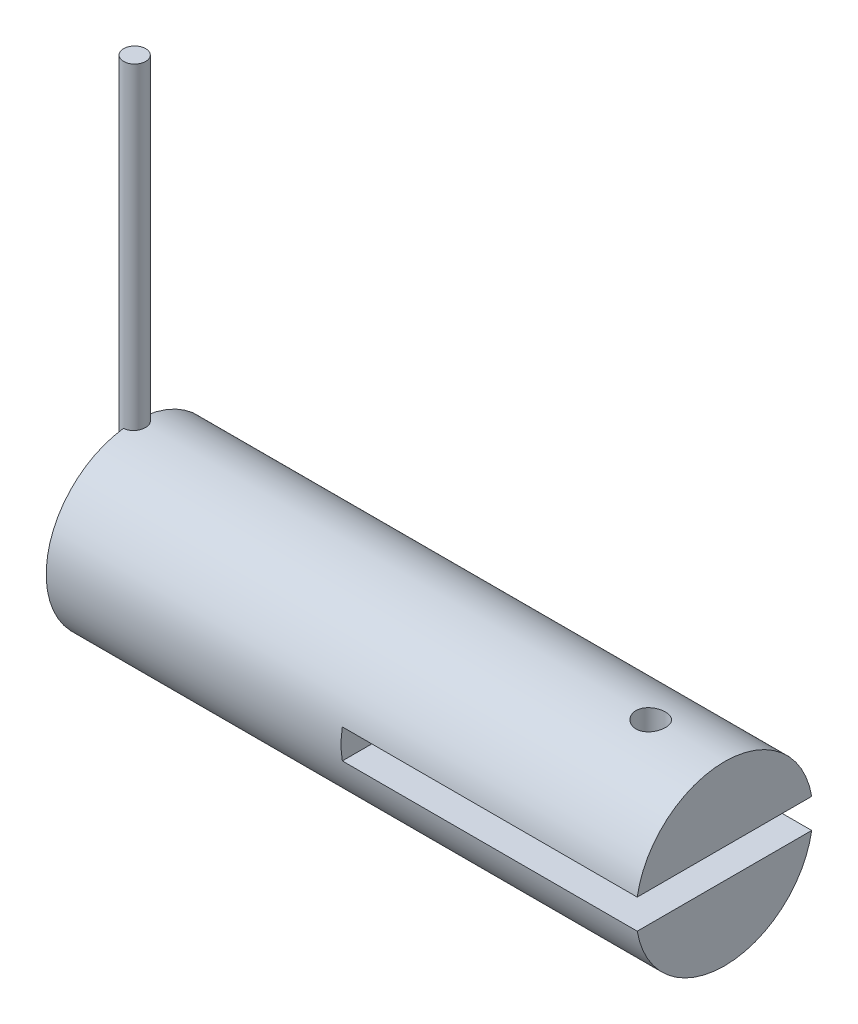
ISO-10303-21;
HEADER;
FILE_DESCRIPTION(('STEP AP214'),'2;1');
FILE_NAME('part.step','',(''),(''),'','','');
FILE_SCHEMA(('AUTOMOTIVE_DESIGN { 1 0 10303 214 1 1 1 1 }'));
ENDSEC;
DATA;
#1=APPLICATION_CONTEXT('core data for automotive mechanical design processes');
#2=APPLICATION_PROTOCOL_DEFINITION('international standard','automotive_design',2000,#1);
#3=PRODUCT_CONTEXT('',#1,'mechanical');
#4=PRODUCT('Part','Part','',(#3));
#5=PRODUCT_RELATED_PRODUCT_CATEGORY('part','',(#4));
#6=PRODUCT_DEFINITION_FORMATION('','',#4);
#7=PRODUCT_DEFINITION_CONTEXT('part definition',#1,'design');
#8=PRODUCT_DEFINITION('design','',#6,#7);
#9=PRODUCT_DEFINITION_SHAPE('','',#8);
#10=(LENGTH_UNIT() NAMED_UNIT(*) SI_UNIT(.MILLI.,.METRE.));
#11=(NAMED_UNIT(*) PLANE_ANGLE_UNIT() SI_UNIT($,.RADIAN.));
#12=(NAMED_UNIT(*) SI_UNIT($,.STERADIAN.) SOLID_ANGLE_UNIT());
#13=UNCERTAINTY_MEASURE_WITH_UNIT(LENGTH_MEASURE(1.E-05),#10,'distance_accuracy_value','');
#14=(GEOMETRIC_REPRESENTATION_CONTEXT(3) GLOBAL_UNCERTAINTY_ASSIGNED_CONTEXT((#13)) GLOBAL_UNIT_ASSIGNED_CONTEXT((#10,
#11,#12)) REPRESENTATION_CONTEXT('',''));
#15=CARTESIAN_POINT('',(0.,0.,0.));
#16=DIRECTION('',(0.,0.,1.));
#17=DIRECTION('',(1.,0.,0.));
#18=AXIS2_PLACEMENT_3D('',#15,#16,#17);
#19=CARTESIAN_POINT('',(80.,0.,0.));
#20=DIRECTION('',(-1.,0.,0.));
#21=DIRECTION('',(0.,0.,1.));
#22=AXIS2_PLACEMENT_3D('',#19,#20,#21);
#23=CYLINDRICAL_SURFACE('',#22,12.);
#24=CARTESIAN_POINT('',(70.,11.8321595661992,-2.));
#25=CARTESIAN_POINT('',(70.1115005985295,11.8321615789328,-1.99999551873586));
#26=CARTESIAN_POINT('',(70.2230620848572,11.8337527390819,-1.99064413522262));
#27=CARTESIAN_POINT('',(70.4430548346105,11.8399396576003,-1.9535019424531));
#28=CARTESIAN_POINT('',(70.5514831150064,11.844538186771,-1.92569412824688));
#29=CARTESIAN_POINT('',(70.7619938266733,11.8562048749385,-1.8525036349364));
#30=CARTESIAN_POINT('',(70.8640814789298,11.8632709694721,-1.80713564394559));
#31=CARTESIAN_POINT('',(71.0591847637742,11.8790741768183,-1.70014919751158));
#32=CARTESIAN_POINT('',(71.1522014156618,11.8878111015538,-1.63853257080107));
#33=CARTESIAN_POINT('',(71.3274502797956,11.906067769247,-1.50015002157324));
#34=CARTESIAN_POINT('',(71.409580105109,11.9155937386236,-1.42325523914587));
#35=CARTESIAN_POINT('',(71.5598346454894,11.9342998453486,-1.25677760375622));
#36=CARTESIAN_POINT('',(71.6279585304923,11.9434799621739,-1.16719399931998));
#37=CARTESIAN_POINT('',(71.7486516537754,11.9605258958617,-0.977218295958691));
#38=CARTESIAN_POINT('',(71.8011256061854,11.9683835394587,-0.87676486516537));
#39=CARTESIAN_POINT('',(71.8884168564244,11.9818298956567,-0.668316497379096));
#40=CARTESIAN_POINT('',(71.9232353023079,11.9874187557813,-0.560322051262553));
#41=CARTESIAN_POINT('',(71.9739140279871,11.9956538777952,-0.340914981075398));
#42=CARTESIAN_POINT('',(71.9899463328038,11.9983268248873,-0.229543109343422));
#43=CARTESIAN_POINT('',(72.0031326033221,12.0005206347422,-0.0056602284206455));
#44=CARTESIAN_POINT('',(72.0002878521978,12.0000417117545,0.10685070282311));
#45=CARTESIAN_POINT('',(71.9759349187775,11.9960068674511,0.32864174806309));
#46=CARTESIAN_POINT('',(71.9546118692727,11.9924814695392,0.437942824560101));
#47=CARTESIAN_POINT('',(71.8941991406028,11.9827838301731,0.651393583689421));
#48=CARTESIAN_POINT('',(71.8551089203284,11.9766115081057,0.755543109321193));
#49=CARTESIAN_POINT('',(71.7600874877478,11.9622615880957,0.956284918226111));
#50=CARTESIAN_POINT('',(71.7040799903341,11.954074938615,1.05284041841523));
#51=CARTESIAN_POINT('',(71.576869741892,11.936605904572,1.23525242387731));
#52=CARTESIAN_POINT('',(71.5056657610314,11.9273234313531,1.32110806233269));
#53=CARTESIAN_POINT('',(71.3490569547046,11.9085621458608,1.48077701875732));
#54=CARTESIAN_POINT('',(71.2634903240792,11.8990823178483,1.55443160180256));
#55=CARTESIAN_POINT('',(71.0811303278274,11.8811036782784,1.68636367075844));
#56=CARTESIAN_POINT('',(70.9843368586538,11.8726048757706,1.74464101482592));
#57=CARTESIAN_POINT('',(70.782086686498,11.8575500364945,1.84419554759062));
#58=CARTESIAN_POINT('',(70.6766204015264,11.8509961864208,1.88545362182338));
#59=CARTESIAN_POINT('',(70.460120742154,11.840609509519,1.94962389665248));
#60=CARTESIAN_POINT('',(70.3490878588541,11.8367764431066,1.97253771261436));
#61=CARTESIAN_POINT('',(70.1260270750703,11.8323116753769,1.99914550790341));
#62=CARTESIAN_POINT('',(70.0140268962383,11.8316422860694,2.00306576632995));
#63=CARTESIAN_POINT('',(69.7909706626474,11.8334802782589,1.99217816214596));
#64=CARTESIAN_POINT('',(69.6799145715888,11.8359875370548,1.97737102289973));
#65=CARTESIAN_POINT('',(69.4626177926473,11.8438614996401,1.92964186794248));
#66=CARTESIAN_POINT('',(69.3563510880976,11.8492100153468,1.89683503251711));
#67=CARTESIAN_POINT('',(69.1508238669764,11.862148584044,1.81415855215382));
#68=CARTESIAN_POINT('',(69.0515637699593,11.8697387711246,1.76428788648075));
#69=CARTESIAN_POINT('',(68.8618603244751,11.8863930271791,1.64836533858338));
#70=CARTESIAN_POINT('',(68.7715067417952,11.8954700448028,1.58216845132749));
#71=CARTESIAN_POINT('',(68.603109173844,11.9140373334389,1.43567157256638));
#72=CARTESIAN_POINT('',(68.5250660551122,11.9235276334827,1.35537058910723));
#73=CARTESIAN_POINT('',(68.382678485817,11.9419713769461,1.18194245626304));
#74=CARTESIAN_POINT('',(68.3184849389724,11.9509182107574,1.08869060270895));
#75=CARTESIAN_POINT('',(68.2066757383961,11.9671608994635,0.892594758359463));
#76=CARTESIAN_POINT('',(68.1590595484209,11.9744568077598,0.789751077976508));
#77=CARTESIAN_POINT('',(68.0819915328361,11.9865468653567,0.577839241201073));
#78=CARTESIAN_POINT('',(68.0524607394121,11.9913518765409,0.468800450082099));
#79=CARTESIAN_POINT('',(68.0121475208289,11.9979646653543,0.247224587899376));
#80=CARTESIAN_POINT('',(68.0013635530141,11.9997726896015,0.134687805457302));
#81=CARTESIAN_POINT('',(67.9988944941502,12.0001843031025,-0.0892330206189368));
#82=CARTESIAN_POINT('',(68.0069797968471,11.9988264161935,-0.200614528482127));
#83=CARTESIAN_POINT('',(68.0415231378155,11.9931374270987,-0.420409579451757));
#84=CARTESIAN_POINT('',(68.0679810732077,11.9888063415615,-0.528823139173974));
#85=CARTESIAN_POINT('',(68.1384305324349,11.9776559106192,-0.739517156734821));
#86=CARTESIAN_POINT('',(68.182402534568,11.970839336327,-0.841804297723049));
#87=CARTESIAN_POINT('',(68.2866063489845,11.9554620550242,-1.03758436238573));
#88=CARTESIAN_POINT('',(68.34683893205,11.9469012653393,-1.13107686889457));
#89=CARTESIAN_POINT('',(68.4826680739684,11.9288610369313,-1.30777035642111));
#90=CARTESIAN_POINT('',(68.558432763801,11.919372196329,-1.39084114448219));
#91=CARTESIAN_POINT('',(68.7228226463231,11.900610426515,-1.54317110076072));
#92=CARTESIAN_POINT('',(68.81145084713,11.8913375483961,-1.61242702936951));
#93=CARTESIAN_POINT('',(68.9997962579917,11.8739867482713,-1.73561141672868));
#94=CARTESIAN_POINT('',(69.0995874718124,11.8659177427663,-1.78942799124615));
#95=CARTESIAN_POINT('',(69.3068873886705,11.8519936807305,-1.87945162912341));
#96=CARTESIAN_POINT('',(69.4143882581419,11.846136413799,-1.91567628417845));
#97=CARTESIAN_POINT('',(69.6019230155899,11.8385979588519,-1.96162084250193));
#98=CARTESIAN_POINT('',(69.6808214463701,11.8361969873557,-1.9759899341371));
#99=CARTESIAN_POINT('',(69.8398027878696,11.8329770823046,-1.99518103614505));
#100=CARTESIAN_POINT('',(69.9198856770594,11.8321581200295,-2.00000321983421));
#101=CARTESIAN_POINT('',(70.,11.8321595661992,-2.));
#102=B_SPLINE_CURVE_WITH_KNOTS('',3,(#24,#25,#26,#27,#28,#29,#30,#31,#32,#33,#34,#35,#36,#37,
#38,#39,#40,#41,#42,#43,#44,#45,#46,#47,#48,#49,#50,#51,#52,#53,#54,#55,#56,#57,#58,#59,#60,#61,
#62,#63,#64,#65,#66,#67,#68,#69,#70,#71,#72,#73,#74,#75,#76,#77,#78,#79,#80,#81,#82,#83,#84,#85,
#86,#87,#88,#89,#90,#91,#92,#93,#94,#95,#96,#97,#98,#99,#100,#101),.UNSPECIFIED.,.T.,.F.,(4,2,2,
2,2,2,2,2,2,2,2,2,2,2,2,2,2,2,2,2,2,2,2,2,2,2,2,2,2,2,2,2,2,2,2,2,2,2,4),(0.,0.334208831142186,
0.668726015970367,1.00296399830012,1.33716437924218,1.6743132732457,2.01148214267556,
2.35066384089147,2.6898234808889,3.02585253978051,3.36185875722152,3.69453696931733,
4.02722531399625,4.36143683311539,4.6956754098141,5.03396898769697,5.37226568596813,
5.71094129998879,6.04958708750458,6.38418833936325,6.71877666731178,7.05124851708392,
7.38374025834857,7.71929874210161,8.05488083544551,8.39395290428304,8.73301400381356,
9.07058387534115,9.40812596729879,9.74158221012731,10.0750365857506,10.4081203186596,
10.7412198431387,11.078135979706,11.4151310310545,11.7545098209465,12.0935485339556,
12.3336853643501,12.5738178352145),.UNSPECIFIED.);
#103=CARTESIAN_POINT('',(70.,11.8321595661992,-2.));
#104=VERTEX_POINT('',#103);
#105=EDGE_CURVE('E204',#104,#104,#102,.T.);
#106=ORIENTED_EDGE('',*,*,#105,.T.);
#107=EDGE_LOOP('',(#106));
#108=FACE_BOUND('',#107,.T.);
#109=CARTESIAN_POINT('',(70.,-11.8321595661992,-2.));
#110=CARTESIAN_POINT('',(69.8884994014706,-11.8321615789328,-1.99999551873586));
#111=CARTESIAN_POINT('',(69.7769379151428,-11.8337527390819,-1.99064413522262));
#112=CARTESIAN_POINT('',(69.5569451653895,-11.8399396576003,-1.9535019424531));
#113=CARTESIAN_POINT('',(69.4485168849936,-11.844538186771,-1.92569412824688));
#114=CARTESIAN_POINT('',(69.2380061733267,-11.8562048749385,-1.85250363493639));
#115=CARTESIAN_POINT('',(69.1359185210702,-11.8632709694721,-1.80713564394559));
#116=CARTESIAN_POINT('',(68.9408152362258,-11.8790741768183,-1.70014919751157));
#117=CARTESIAN_POINT('',(68.8477985843382,-11.8878111015538,-1.63853257080106));
#118=CARTESIAN_POINT('',(68.6725497202044,-11.906067769247,-1.50015002157324));
#119=CARTESIAN_POINT('',(68.5904198948911,-11.9155937386236,-1.42325523914587));
#120=CARTESIAN_POINT('',(68.4401653545106,-11.9342998453486,-1.25677760375622));
#121=CARTESIAN_POINT('',(68.3720414695077,-11.9434799621739,-1.16719399931998));
#122=CARTESIAN_POINT('',(68.2513483462246,-11.9605258958617,-0.977218295958691));
#123=CARTESIAN_POINT('',(68.1988743938146,-11.9683835394587,-0.87676486516537));
#124=CARTESIAN_POINT('',(68.1115831435756,-11.9818298956567,-0.668316497379096));
#125=CARTESIAN_POINT('',(68.0767646976921,-11.9874187557813,-0.560322051262553));
#126=CARTESIAN_POINT('',(68.0260859720129,-11.9956538777952,-0.340914981075398));
#127=CARTESIAN_POINT('',(68.0100536671963,-11.9983268248873,-0.229543109343422));
#128=CARTESIAN_POINT('',(67.9968673966779,-12.0005206347422,-0.0056602284206455));
#129=CARTESIAN_POINT('',(67.9997121478022,-12.0000417117545,0.10685070282311));
#130=CARTESIAN_POINT('',(68.0240650812226,-11.9960068674511,0.32864174806309));
#131=CARTESIAN_POINT('',(68.0453881307273,-11.9924814695392,0.437942824560101));
#132=CARTESIAN_POINT('',(68.1058008593972,-11.9827838301731,0.651393583689421));
#133=CARTESIAN_POINT('',(68.1448910796716,-11.9766115081057,0.755543109321192));
#134=CARTESIAN_POINT('',(68.2399125122523,-11.9622615880957,0.956284918226111));
#135=CARTESIAN_POINT('',(68.295920009666,-11.954074938615,1.05284041841523));
#136=CARTESIAN_POINT('',(68.423130258108,-11.936605904572,1.23525242387731));
#137=CARTESIAN_POINT('',(68.4943342389687,-11.9273234313531,1.32110806233269));
#138=CARTESIAN_POINT('',(68.6509430452954,-11.9085621458608,1.48077701875732));
#139=CARTESIAN_POINT('',(68.7365096759208,-11.8990823178483,1.55443160180255));
#140=CARTESIAN_POINT('',(68.9188696721726,-11.8811036782784,1.68636367075844));
#141=CARTESIAN_POINT('',(69.0156631413463,-11.8726048757706,1.74464101482592));
#142=CARTESIAN_POINT('',(69.217913313502,-11.8575500364945,1.84419554759062));
#143=CARTESIAN_POINT('',(69.3233795984737,-11.8509961864208,1.88545362182338));
#144=CARTESIAN_POINT('',(69.539879257846,-11.840609509519,1.94962389665248));
#145=CARTESIAN_POINT('',(69.6509121411459,-11.8367764431066,1.97253771261436));
#146=CARTESIAN_POINT('',(69.8739729249297,-11.8323116753769,1.99914550790341));
#147=CARTESIAN_POINT('',(69.9859731037617,-11.8316422860694,2.00306576632995));
#148=CARTESIAN_POINT('',(70.2090293373526,-11.8334802782589,1.99217816214597));
#149=CARTESIAN_POINT('',(70.3200854284112,-11.8359875370548,1.97737102289973));
#150=CARTESIAN_POINT('',(70.5373822073527,-11.8438614996401,1.92964186794248));
#151=CARTESIAN_POINT('',(70.6436489119024,-11.8492100153468,1.89683503251711));
#152=CARTESIAN_POINT('',(70.8491761330236,-11.862148584044,1.81415855215383));
#153=CARTESIAN_POINT('',(70.9484362300407,-11.8697387711246,1.76428788648075));
#154=CARTESIAN_POINT('',(71.1381396755249,-11.8863930271791,1.64836533858338));
#155=CARTESIAN_POINT('',(71.2284932582048,-11.8954700448028,1.58216845132749));
#156=CARTESIAN_POINT('',(71.396890826156,-11.9140373334389,1.43567157256638));
#157=CARTESIAN_POINT('',(71.4749339448878,-11.9235276334827,1.35537058910723));
#158=CARTESIAN_POINT('',(71.617321514183,-11.9419713769461,1.18194245626304));
#159=CARTESIAN_POINT('',(71.6815150610276,-11.9509182107574,1.08869060270895));
#160=CARTESIAN_POINT('',(71.7933242616039,-11.9671608994635,0.892594758359458));
#161=CARTESIAN_POINT('',(71.8409404515791,-11.9744568077598,0.789751077976505));
#162=CARTESIAN_POINT('',(71.9180084671639,-11.9865468653567,0.577839241201073));
#163=CARTESIAN_POINT('',(71.9475392605879,-11.9913518765409,0.468800450082099));
#164=CARTESIAN_POINT('',(71.9878524791711,-11.9979646653543,0.247224587899376));
#165=CARTESIAN_POINT('',(71.9986364469859,-11.9997726896015,0.134687805457302));
#166=CARTESIAN_POINT('',(72.0011055058498,-12.0001843031025,-0.0892330206189367));
#167=CARTESIAN_POINT('',(71.9930202031529,-11.9988264161935,-0.200614528482127));
#168=CARTESIAN_POINT('',(71.9584768621845,-11.9931374270987,-0.420409579451757));
#169=CARTESIAN_POINT('',(71.9320189267923,-11.9888063415615,-0.528823139173974));
#170=CARTESIAN_POINT('',(71.8615694675651,-11.9776559106192,-0.739517156734819));
#171=CARTESIAN_POINT('',(71.817597465432,-11.970839336327,-0.841804297723045));
#172=CARTESIAN_POINT('',(71.7133936510156,-11.9554620550242,-1.03758436238572));
#173=CARTESIAN_POINT('',(71.65316106795,-11.9469012653393,-1.13107686889457));
#174=CARTESIAN_POINT('',(71.5173319260316,-11.9288610369313,-1.30777035642111));
#175=CARTESIAN_POINT('',(71.441567236199,-11.919372196329,-1.39084114448219));
#176=CARTESIAN_POINT('',(71.277177353677,-11.900610426515,-1.54317110076072));
#177=CARTESIAN_POINT('',(71.18854915287,-11.8913375483961,-1.61242702936951));
#178=CARTESIAN_POINT('',(71.0002037420083,-11.8739867482713,-1.73561141672868));
#179=CARTESIAN_POINT('',(70.9004125281876,-11.8659177427663,-1.78942799124615));
#180=CARTESIAN_POINT('',(70.6931126113295,-11.8519936807305,-1.87945162912341));
#181=CARTESIAN_POINT('',(70.5856117418581,-11.846136413799,-1.91567628417845));
#182=CARTESIAN_POINT('',(70.3980769844101,-11.8385979588519,-1.96162084250193));
#183=CARTESIAN_POINT('',(70.3191785536299,-11.8361969873557,-1.9759899341371));
#184=CARTESIAN_POINT('',(70.1601972121305,-11.8329770823046,-1.99518103614505));
#185=CARTESIAN_POINT('',(70.0801143229406,-11.8321581200295,-2.00000321983421));
#186=CARTESIAN_POINT('',(70.,-11.8321595661992,-2.));
#187=B_SPLINE_CURVE_WITH_KNOTS('',3,(#109,#110,#111,#112,#113,#114,#115,#116,#117,#118,#119,
#120,#121,#122,#123,#124,#125,#126,#127,#128,#129,#130,#131,#132,#133,#134,#135,#136,#137,#138,
#139,#140,#141,#142,#143,#144,#145,#146,#147,#148,#149,#150,#151,#152,#153,#154,#155,#156,#157,
#158,#159,#160,#161,#162,#163,#164,#165,#166,#167,#168,#169,#170,#171,#172,#173,#174,#175,#176,
#177,#178,#179,#180,#181,#182,#183,#184,#185,#186),.UNSPECIFIED.,.T.,.F.,(4,2,2,2,2,2,2,2,2,2,2,
2,2,2,2,2,2,2,2,2,2,2,2,2,2,2,2,2,2,2,2,2,2,2,2,2,2,2,4),(0.,0.334208831142186,
0.668726015970367,1.00296399830014,1.33716437924218,1.6743132732457,2.01148214267556,
2.35066384089147,2.6898234808889,3.02585253978051,3.36185875722152,3.69453696931733,
4.02722531399625,4.36143683311539,4.6956754098141,5.03396898769696,5.37226568596813,
5.71094129998879,6.04958708750458,6.38418833936325,6.71877666731178,7.0512485170839,
7.38374025834857,7.71929874210161,8.05488083544551,8.39395290428305,8.73301400381356,
9.07058387534115,9.40812596729879,9.74158221012731,10.0750365857506,10.4081203186596,
10.7412198431387,11.078135979706,11.4151310310545,11.7545098209465,12.0935485339556,
12.3336853643501,12.5738178352145),.UNSPECIFIED.);
#188=CARTESIAN_POINT('',(70.,-11.8321595661992,-2.));
#189=VERTEX_POINT('',#188);
#190=EDGE_CURVE('E196',#189,#189,#187,.T.);
#191=ORIENTED_EDGE('',*,*,#190,.T.);
#192=EDGE_LOOP('',(#191));
#193=FACE_BOUND('',#192,.T.);
#194=CARTESIAN_POINT('',(0.,0.,0.));
#195=DIRECTION('',(1.,0.,0.));
#196=DIRECTION('',(0.,0.,-1.));
#197=AXIS2_PLACEMENT_3D('',#194,#195,#196);
#198=CIRCLE('',#197,12.);
#199=CARTESIAN_POINT('',(0.,11.9058808997907,1.5));
#200=VERTEX_POINT('',#199);
#201=CARTESIAN_POINT('',(0.,11.9058808997907,-1.5));
#202=VERTEX_POINT('',#201);
#203=EDGE_CURVE('E142',#200,#202,#198,.T.);
#204=ORIENTED_EDGE('',*,*,#203,.T.);
#205=CARTESIAN_POINT('',(0.,11.9058808997907,-1.5));
#206=CARTESIAN_POINT('',(0.0420256146073222,11.9058796167841,-1.49999991622302));
#207=CARTESIAN_POINT('',(0.0840309336319481,11.9061036976489,-1.49823273520494));
#208=CARTESIAN_POINT('',(0.167737752110471,11.9069890765987,-1.49118401871586));
#209=CARTESIAN_POINT('',(0.209439274711459,11.9076503410136,-1.48590275388467));
#210=CARTESIAN_POINT('',(0.33354449359674,11.9102663569831,-1.46484409153041));
#211=CARTESIAN_POINT('',(0.41511173508675,11.9128534327702,-1.44385164934018));
#212=CARTESIAN_POINT('',(0.573527004724412,11.9194231379643,-1.38856665480418));
#213=CARTESIAN_POINT('',(0.65037347937228,11.9234062239066,-1.35426975112646));
#214=CARTESIAN_POINT('',(0.797226590277592,11.9323173233259,-1.27336303124173));
#215=CARTESIAN_POINT('',(0.867233759670402,11.937245263061,-1.22675417582287));
#216=CARTESIAN_POINT('',(0.99879503669144,11.9475210801608,-1.12227471156271));
#217=CARTESIAN_POINT('',(1.06030604341449,11.9528708969012,-1.06435003917232));
#218=CARTESIAN_POINT('',(1.17276812659724,11.9633708698662,-0.938992106161599));
#219=CARTESIAN_POINT('',(1.22371759349248,11.968520995561,-0.871557398852176));
#220=CARTESIAN_POINT('',(1.31375756690505,11.9780608089149,-0.728823769679976));
#221=CARTESIAN_POINT('',(1.35280856563805,11.9824479428746,-0.653499740788965));
#222=CARTESIAN_POINT('',(1.41768823459535,11.9899456072788,-0.497303231084269));
#223=CARTESIAN_POINT('',(1.44351817763493,11.9930562606067,-0.416431285229129));
#224=CARTESIAN_POINT('',(1.48109501804218,11.9976369842641,-0.251878411535809));
#225=CARTESIAN_POINT('',(1.49291472266168,11.9991155333945,-0.168214349574172));
#226=CARTESIAN_POINT('',(1.50236128593352,12.0002944253471,-7.59720358594387E-05));
#227=CARTESIAN_POINT('',(1.49998835933553,11.999994795075,0.0843983312616883));
#228=CARTESIAN_POINT('',(1.48117485484457,11.997657883472,0.251259389835891));
#229=CARTESIAN_POINT('',(1.46481297742457,11.9956303235099,0.333655173883563));
#230=CARTESIAN_POINT('',(1.41860912525517,11.9900763165506,0.494521726174142));
#231=CARTESIAN_POINT('',(1.38876696757148,11.9865498492125,0.572992441135805));
#232=CARTESIAN_POINT('',(1.31636536122453,11.9783774600856,0.724026886781137));
#233=CARTESIAN_POINT('',(1.27377160977409,11.9737285253829,0.79657400394016));
#234=CARTESIAN_POINT('',(1.17710260075657,11.9638315925688,0.933517208730051));
#235=CARTESIAN_POINT('',(1.1230273014989,11.9585835922822,0.997913266762296));
#236=CARTESIAN_POINT('',(1.0044979862678,11.9480339810146,1.11718400517337));
#237=CARTESIAN_POINT('',(0.939976781806094,11.9427322465609,1.17199191710905));
#238=CARTESIAN_POINT('',(0.80259131370217,11.9327058347276,1.27002700826679));
#239=CARTESIAN_POINT('',(0.729724579364924,11.9279813290967,1.31325074527737));
#240=CARTESIAN_POINT('',(0.577647165347911,11.9196437282205,1.38689353578027));
#241=CARTESIAN_POINT('',(0.498430153814829,11.9160317601021,1.4172996149465));
#242=CARTESIAN_POINT('',(0.336016793072396,11.9103465131834,1.4643142294323));
#243=CARTESIAN_POINT('',(0.252826637293169,11.9082709177465,1.48094354273396));
#244=CARTESIAN_POINT('',(0.140864894079444,11.906680673736,1.49363970450895));
#245=CARTESIAN_POINT('',(0.112720638792691,11.9063809716398,1.49602594662134));
#246=CARTESIAN_POINT('',(0.0563882291230976,11.9059813178585,1.49920396125349));
#247=CARTESIAN_POINT('',(0.0282002279293766,11.9058810314323,1.4999984057964));
#248=CARTESIAN_POINT('',(0.,11.9058808997907,1.5));
#249=B_SPLINE_CURVE_WITH_KNOTS('',3,(#205,#206,#207,#208,#209,#210,#211,#212,#213,#214,#215,
#216,#217,#218,#219,#220,#221,#222,#223,#224,#225,#226,#227,#228,#229,#230,#231,#232,#233,#234,
#235,#236,#237,#238,#239,#240,#241,#242,#243,#244,#245,#246,#247,#248),.UNSPECIFIED.,.F.,.F.,(4,
2,2,2,2,2,2,2,2,2,2,2,2,2,2,2,2,2,2,2,2,4),(0.,0.125998885431965,0.25198806808823,
0.503484009278924,0.75506227369856,1.00662091149464,1.25941218745262,1.51224196018406,
1.76590230551494,2.01953822590382,2.27185021125891,2.52415837887359,2.77505635591515,
3.02595773787265,3.27754022346678,3.52912362259636,3.78239467697147,4.03574090703683,
4.28934296772916,4.54256184839944,4.62726904837805,4.71183393763524),.UNSPECIFIED.);
#250=EDGE_CURVE('E11',#202,#200,#249,.T.);
#251=ORIENTED_EDGE('',*,*,#250,.T.);
#252=EDGE_LOOP('',(#204,#251));
#253=FACE_BOUND('',#252,.T.);
#254=DIRECTION('',(1.,0.,0.));
#255=VECTOR('',#254,1.);
#256=CARTESIAN_POINT('',(40.,2.,11.8321595661992));
#257=LINE('',#256,#255);
#258=CARTESIAN_POINT('',(40.,2.,11.8321595661992));
#259=VERTEX_POINT('',#258);
#260=CARTESIAN_POINT('',(80.,2.,11.8321595661992));
#261=VERTEX_POINT('',#260);
#262=EDGE_CURVE('E95',#259,#261,#257,.T.);
#263=ORIENTED_EDGE('',*,*,#262,.T.);
#264=CARTESIAN_POINT('',(80.,0.,0.));
#265=DIRECTION('',(1.,0.,0.));
#266=DIRECTION('',(0.,0.,-1.));
#267=AXIS2_PLACEMENT_3D('',#264,#265,#266);
#268=CIRCLE('',#267,12.);
#269=CARTESIAN_POINT('',(80.,2.,-11.8321595661992));
#270=VERTEX_POINT('',#269);
#271=EDGE_CURVE('E152',#270,#261,#268,.T.);
#272=ORIENTED_EDGE('',*,*,#271,.F.);
#273=DIRECTION('',(1.,0.,0.));
#274=VECTOR('',#273,1.);
#275=CARTESIAN_POINT('',(40.,2.,-11.8321595661992));
#276=LINE('',#275,#274);
#277=CARTESIAN_POINT('',(40.,2.,-11.8321595661992));
#278=VERTEX_POINT('',#277);
#279=EDGE_CURVE('E138',#278,#270,#276,.T.);
#280=ORIENTED_EDGE('',*,*,#279,.F.);
#281=CARTESIAN_POINT('',(40.,0.,0.));
#282=DIRECTION('',(1.,0.,0.));
#283=DIRECTION('',(0.,0.,-1.));
#284=AXIS2_PLACEMENT_3D('',#281,#282,#283);
#285=CIRCLE('',#284,12.);
#286=CARTESIAN_POINT('',(40.,-2.,-11.8321595661992));
#287=VERTEX_POINT('',#286);
#288=EDGE_CURVE('E107',#287,#278,#285,.T.);
#289=ORIENTED_EDGE('',*,*,#288,.F.);
#290=DIRECTION('',(1.,0.,0.));
#291=VECTOR('',#290,1.);
#292=CARTESIAN_POINT('',(40.,-2.,-11.8321595661992));
#293=LINE('',#292,#291);
#294=CARTESIAN_POINT('',(80.,-2.,-11.8321595661992));
#295=VERTEX_POINT('',#294);
#296=EDGE_CURVE('E133',#287,#295,#293,.T.);
#297=ORIENTED_EDGE('',*,*,#296,.T.);
#298=CARTESIAN_POINT('',(80.,-2.,11.8321595661992));
#299=VERTEX_POINT('',#298);
#300=EDGE_CURVE('E147',#299,#295,#268,.T.);
#301=ORIENTED_EDGE('',*,*,#300,.F.);
#302=DIRECTION('',(1.,0.,0.));
#303=VECTOR('',#302,1.);
#304=CARTESIAN_POINT('',(40.,-2.,11.8321595661992));
#305=LINE('',#304,#303);
#306=CARTESIAN_POINT('',(40.,-2.,11.8321595661992));
#307=VERTEX_POINT('',#306);
#308=EDGE_CURVE('E58',#307,#299,#305,.T.);
#309=ORIENTED_EDGE('',*,*,#308,.F.);
#310=EDGE_CURVE('E113',#259,#307,#285,.T.);
#311=ORIENTED_EDGE('',*,*,#310,.F.);
#312=EDGE_LOOP('',(#263,#272,#280,#289,#297,#301,#309,#311));
#313=FACE_BOUND('',#312,.T.);
#314=ADVANCED_FACE('F40',(#108,#193,#253,#313),#23,.T.);
#315=CARTESIAN_POINT('',(80.,0.,0.));
#316=DIRECTION('',(1.,0.,0.));
#317=DIRECTION('',(0.,0.,-1.));
#318=AXIS2_PLACEMENT_3D('',#315,#316,#317);
#319=PLANE('',#318);
#320=ORIENTED_EDGE('',*,*,#271,.T.);
#321=DIRECTION('',(0.,0.,-1.));
#322=VECTOR('',#321,1.);
#323=CARTESIAN_POINT('',(80.,2.,0.));
#324=LINE('',#323,#322);
#325=EDGE_CURVE('E101',#261,#270,#324,.T.);
#326=ORIENTED_EDGE('',*,*,#325,.T.);
#327=EDGE_LOOP('',(#320,#326));
#328=FACE_BOUND('',#327,.T.);
#329=ADVANCED_FACE('F187',(#328),#319,.T.);
#330=CARTESIAN_POINT('',(0.,55.,0.));
#331=DIRECTION('',(0.,-1.,0.));
#332=DIRECTION('',(0.,0.,-1.));
#333=AXIS2_PLACEMENT_3D('',#330,#331,#332);
#334=CYLINDRICAL_SURFACE('',#333,1.5);
#335=CARTESIAN_POINT('',(0.,55.,0.));
#336=DIRECTION('',(0.,1.,0.));
#337=DIRECTION('',(0.,0.,1.));
#338=AXIS2_PLACEMENT_3D('',#335,#336,#337);
#339=CIRCLE('',#338,1.5);
#340=CARTESIAN_POINT('',(0.,55.,1.5));
#341=VERTEX_POINT('',#340);
#342=EDGE_CURVE('E167',#341,#341,#339,.T.);
#343=ORIENTED_EDGE('',*,*,#342,.F.);
#344=EDGE_LOOP('',(#343));
#345=FACE_BOUND('',#344,.T.);
#346=DIRECTION('',(0.,-1.,0.));
#347=VECTOR('',#346,1.);
#348=CARTESIAN_POINT('',(0.,55.,1.5));
#349=LINE('',#348,#347);
#350=CARTESIAN_POINT('',(0.,0.,1.5));
#351=VERTEX_POINT('',#350);
#352=EDGE_CURVE('E66',#200,#351,#349,.T.);
#353=ORIENTED_EDGE('',*,*,#352,.F.);
#354=ORIENTED_EDGE('',*,*,#250,.F.);
#355=DIRECTION('',(0.,-1.,0.));
#356=VECTOR('',#355,1.);
#357=CARTESIAN_POINT('',(0.,55.,-1.5));
#358=LINE('',#357,#356);
#359=CARTESIAN_POINT('',(0.,0.,-1.5));
#360=VERTEX_POINT('',#359);
#361=EDGE_CURVE('E156',#360,#202,#358,.F.);
#362=ORIENTED_EDGE('',*,*,#361,.F.);
#363=CARTESIAN_POINT('',(0.,0.,0.));
#364=DIRECTION('',(0.,1.,0.));
#365=DIRECTION('',(0.,0.,1.));
#366=AXIS2_PLACEMENT_3D('',#363,#364,#365);
#367=CIRCLE('',#366,1.5);
#368=EDGE_CURVE('E163',#360,#351,#367,.T.);
#369=ORIENTED_EDGE('',*,*,#368,.T.);
#370=EDGE_LOOP('',(#353,#354,#362,#369));
#371=FACE_BOUND('',#370,.T.);
#372=ADVANCED_FACE('F42',(#345,#371),#334,.T.);
#373=CARTESIAN_POINT('',(0.,0.,0.));
#374=DIRECTION('',(0.,1.,0.));
#375=DIRECTION('',(0.,0.,1.));
#376=AXIS2_PLACEMENT_3D('',#373,#374,#375);
#377=PLANE('',#376);
#378=DIRECTION('',(0.,0.,-1.));
#379=VECTOR('',#378,1.);
#380=CARTESIAN_POINT('',(0.,0.,0.));
#381=LINE('',#380,#379);
#382=EDGE_CURVE('E51',#351,#360,#381,.T.);
#383=ORIENTED_EDGE('',*,*,#382,.F.);
#384=ORIENTED_EDGE('',*,*,#368,.F.);
#385=EDGE_LOOP('',(#383,#384));
#386=FACE_BOUND('',#385,.T.);
#387=ADVANCED_FACE('F235',(#386),#377,.F.);
#388=CARTESIAN_POINT('',(0.,55.,0.));
#389=DIRECTION('',(0.,1.,0.));
#390=DIRECTION('',(0.,0.,1.));
#391=AXIS2_PLACEMENT_3D('',#388,#389,#390);
#392=PLANE('',#391);
#393=ORIENTED_EDGE('',*,*,#342,.T.);
#394=EDGE_LOOP('',(#393));
#395=FACE_BOUND('',#394,.T.);
#396=ADVANCED_FACE('F191',(#395),#392,.T.);
#397=CARTESIAN_POINT('',(0.,0.,0.));
#398=DIRECTION('',(1.,0.,0.));
#399=DIRECTION('',(0.,0.,-1.));
#400=AXIS2_PLACEMENT_3D('',#397,#398,#399);
#401=PLANE('',#400);
#402=ORIENTED_EDGE('',*,*,#203,.F.);
#403=ORIENTED_EDGE('',*,*,#352,.T.);
#404=ORIENTED_EDGE('',*,*,#382,.T.);
#405=ORIENTED_EDGE('',*,*,#361,.T.);
#406=EDGE_LOOP('',(#402,#403,#404,#405));
#407=FACE_BOUND('',#406,.T.);
#408=ADVANCED_FACE('F189',(#407),#401,.F.);
#409=DIRECTION('',(0.,0.,-1.));
#410=VECTOR('',#409,1.);
#411=CARTESIAN_POINT('',(80.,-2.,0.));
#412=LINE('',#411,#410);
#413=EDGE_CURVE('E117',#299,#295,#412,.T.);
#414=ORIENTED_EDGE('',*,*,#413,.F.);
#415=ORIENTED_EDGE('',*,*,#300,.T.);
#416=EDGE_LOOP('',(#414,#415));
#417=FACE_BOUND('',#416,.T.);
#418=ADVANCED_FACE('F223',(#417),#319,.T.);
#419=CARTESIAN_POINT('',(40.,2.,0.));
#420=DIRECTION('',(0.,-1.,0.));
#421=DIRECTION('',(0.,0.,-1.));
#422=AXIS2_PLACEMENT_3D('',#419,#420,#421);
#423=PLANE('',#422);
#424=CARTESIAN_POINT('',(70.,2.,0.));
#425=DIRECTION('',(0.,-1.,0.));
#426=DIRECTION('',(0.,0.,-1.));
#427=AXIS2_PLACEMENT_3D('',#424,#425,#426);
#428=CIRCLE('',#427,2.);
#429=CARTESIAN_POINT('',(70.,2.,-2.));
#430=VERTEX_POINT('',#429);
#431=EDGE_CURVE('E205',#430,#430,#428,.T.);
#432=ORIENTED_EDGE('',*,*,#431,.F.);
#433=EDGE_LOOP('',(#432));
#434=FACE_BOUND('',#433,.T.);
#435=ORIENTED_EDGE('',*,*,#325,.F.);
#436=ORIENTED_EDGE('',*,*,#262,.F.);
#437=DIRECTION('',(0.,0.,-1.));
#438=VECTOR('',#437,1.);
#439=CARTESIAN_POINT('',(40.,2.,0.));
#440=LINE('',#439,#438);
#441=EDGE_CURVE('E98',#259,#278,#440,.T.);
#442=ORIENTED_EDGE('',*,*,#441,.T.);
#443=ORIENTED_EDGE('',*,*,#279,.T.);
#444=EDGE_LOOP('',(#435,#436,#442,#443));
#445=FACE_BOUND('',#444,.T.);
#446=ADVANCED_FACE('F97',(#434,#445),#423,.T.);
#447=CARTESIAN_POINT('',(40.,-2.,0.));
#448=DIRECTION('',(0.,-1.,0.));
#449=DIRECTION('',(0.,0.,-1.));
#450=AXIS2_PLACEMENT_3D('',#447,#448,#449);
#451=PLANE('',#450);
#452=CARTESIAN_POINT('',(70.,-2.,0.));
#453=DIRECTION('',(0.,-1.,0.));
#454=DIRECTION('',(0.,0.,-1.));
#455=AXIS2_PLACEMENT_3D('',#452,#453,#454);
#456=CIRCLE('',#455,2.);
#457=CARTESIAN_POINT('',(70.,-2.,-2.));
#458=VERTEX_POINT('',#457);
#459=EDGE_CURVE('E45',#458,#458,#456,.T.);
#460=ORIENTED_EDGE('',*,*,#459,.T.);
#461=EDGE_LOOP('',(#460));
#462=FACE_BOUND('',#461,.T.);
#463=ORIENTED_EDGE('',*,*,#413,.T.);
#464=ORIENTED_EDGE('',*,*,#296,.F.);
#465=DIRECTION('',(0.,0.,-1.));
#466=VECTOR('',#465,1.);
#467=CARTESIAN_POINT('',(40.,-2.,0.));
#468=LINE('',#467,#466);
#469=EDGE_CURVE('E121',#307,#287,#468,.T.);
#470=ORIENTED_EDGE('',*,*,#469,.F.);
#471=ORIENTED_EDGE('',*,*,#308,.T.);
#472=EDGE_LOOP('',(#463,#464,#470,#471));
#473=FACE_BOUND('',#472,.T.);
#474=ADVANCED_FACE('F218',(#462,#473),#451,.F.);
#475=CARTESIAN_POINT('',(40.,0.,0.));
#476=DIRECTION('',(1.,0.,0.));
#477=DIRECTION('',(0.,0.,-1.));
#478=AXIS2_PLACEMENT_3D('',#475,#476,#477);
#479=PLANE('',#478);
#480=ORIENTED_EDGE('',*,*,#441,.F.);
#481=ORIENTED_EDGE('',*,*,#310,.T.);
#482=ORIENTED_EDGE('',*,*,#469,.T.);
#483=ORIENTED_EDGE('',*,*,#288,.T.);
#484=EDGE_LOOP('',(#480,#481,#482,#483));
#485=FACE_BOUND('',#484,.T.);
#486=ADVANCED_FACE('F111',(#485),#479,.T.);
#487=CARTESIAN_POINT('',(70.,55.,0.));
#488=DIRECTION('',(0.,-1.,0.));
#489=DIRECTION('',(0.,0.,-1.));
#490=AXIS2_PLACEMENT_3D('',#487,#488,#489);
#491=CYLINDRICAL_SURFACE('',#490,2.);
#492=ORIENTED_EDGE('',*,*,#459,.F.);
#493=EDGE_LOOP('',(#492));
#494=FACE_BOUND('',#493,.T.);
#495=ORIENTED_EDGE('',*,*,#190,.F.);
#496=EDGE_LOOP('',(#495));
#497=FACE_BOUND('',#496,.T.);
#498=ADVANCED_FACE('F213',(#494,#497),#491,.F.);
#499=ORIENTED_EDGE('',*,*,#431,.T.);
#500=EDGE_LOOP('',(#499));
#501=FACE_BOUND('',#500,.T.);
#502=ORIENTED_EDGE('',*,*,#105,.F.);
#503=EDGE_LOOP('',(#502));
#504=FACE_BOUND('',#503,.T.);
#505=ADVANCED_FACE('F209',(#501,#504),#491,.F.);
#506=CLOSED_SHELL('',(#314,#329,#372,#387,#396,#408,#418,#446,#474,#486,#498,#505));
#507=MANIFOLD_SOLID_BREP('B2',#506);
#508=ADVANCED_BREP_SHAPE_REPRESENTATION('',(#18,#507),#14);
#509=SHAPE_DEFINITION_REPRESENTATION(#9,#508);
ENDSEC;
END-ISO-10303-21;
